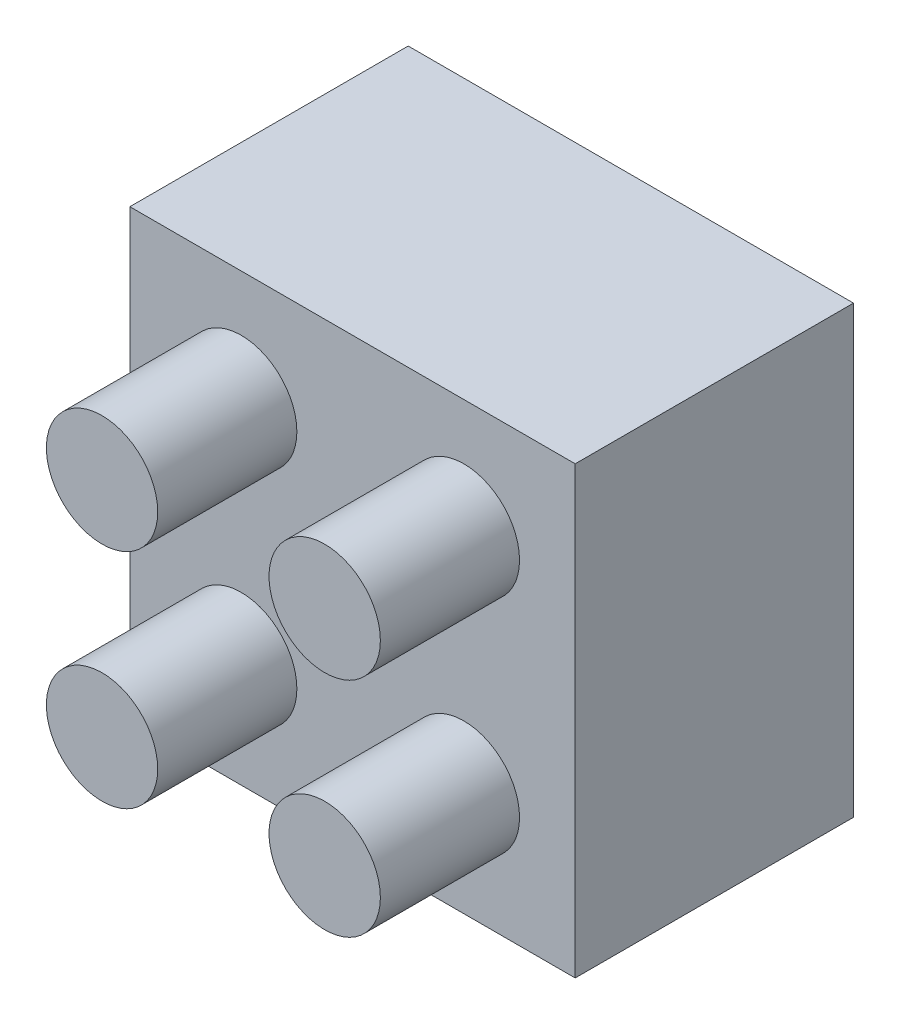
ISO-10303-21;
HEADER;
FILE_DESCRIPTION(('STEP AP214'),'2;1');
FILE_NAME('part.step','',(''),(''),'','','');
FILE_SCHEMA(('AUTOMOTIVE_DESIGN { 1 0 10303 214 1 1 1 1 }'));
ENDSEC;
DATA;
#1=APPLICATION_CONTEXT('core data for automotive mechanical design processes');
#2=APPLICATION_PROTOCOL_DEFINITION('international standard','automotive_design',2000,#1);
#3=PRODUCT_CONTEXT('',#1,'mechanical');
#4=PRODUCT('Part','Part','',(#3));
#5=PRODUCT_RELATED_PRODUCT_CATEGORY('part','',(#4));
#6=PRODUCT_DEFINITION_FORMATION('','',#4);
#7=PRODUCT_DEFINITION_CONTEXT('part definition',#1,'design');
#8=PRODUCT_DEFINITION('design','',#6,#7);
#9=PRODUCT_DEFINITION_SHAPE('','',#8);
#10=(LENGTH_UNIT() NAMED_UNIT(*) SI_UNIT(.MILLI.,.METRE.));
#11=(NAMED_UNIT(*) PLANE_ANGLE_UNIT() SI_UNIT($,.RADIAN.));
#12=(NAMED_UNIT(*) SI_UNIT($,.STERADIAN.) SOLID_ANGLE_UNIT());
#13=UNCERTAINTY_MEASURE_WITH_UNIT(LENGTH_MEASURE(1.E-05),#10,'distance_accuracy_value','');
#14=(GEOMETRIC_REPRESENTATION_CONTEXT(3) GLOBAL_UNCERTAINTY_ASSIGNED_CONTEXT((#13)) GLOBAL_UNIT_ASSIGNED_CONTEXT((#10,
#11,#12)) REPRESENTATION_CONTEXT('',''));
#15=CARTESIAN_POINT('',(0.,0.,0.));
#16=DIRECTION('',(0.,0.,1.));
#17=DIRECTION('',(1.,0.,0.));
#18=AXIS2_PLACEMENT_3D('',#15,#16,#17);
#19=CARTESIAN_POINT('',(8.,8.,10.));
#20=DIRECTION('',(-1.,0.,0.));
#21=DIRECTION('',(0.,-1.,0.));
#22=AXIS2_PLACEMENT_3D('',#19,#20,#21);
#23=PLANE('',#22);
#24=DIRECTION('',(0.,1.,0.));
#25=VECTOR('',#24,1.);
#26=CARTESIAN_POINT('',(8.,8.,0.));
#27=LINE('',#26,#25);
#28=CARTESIAN_POINT('',(8.00000000000001,-8.,0.));
#29=VERTEX_POINT('',#28);
#30=CARTESIAN_POINT('',(8.,8.,0.));
#31=VERTEX_POINT('',#30);
#32=EDGE_CURVE('E170',#29,#31,#27,.T.);
#33=ORIENTED_EDGE('',*,*,#32,.T.);
#34=DIRECTION('',(0.,0.,-1.));
#35=VECTOR('',#34,1.);
#36=CARTESIAN_POINT('',(8.,8.,10.));
#37=LINE('',#36,#35);
#38=CARTESIAN_POINT('',(8.,8.,10.));
#39=VERTEX_POINT('',#38);
#40=EDGE_CURVE('E40',#39,#31,#37,.T.);
#41=ORIENTED_EDGE('',*,*,#40,.F.);
#42=DIRECTION('',(0.,1.,0.));
#43=VECTOR('',#42,1.);
#44=CARTESIAN_POINT('',(8.,8.,10.));
#45=LINE('',#44,#43);
#46=CARTESIAN_POINT('',(8.00000000000001,-8.,10.));
#47=VERTEX_POINT('',#46);
#48=EDGE_CURVE('E173',#47,#39,#45,.T.);
#49=ORIENTED_EDGE('',*,*,#48,.F.);
#50=DIRECTION('',(0.,0.,-1.));
#51=VECTOR('',#50,1.);
#52=CARTESIAN_POINT('',(8.00000000000001,-8.,10.));
#53=LINE('',#52,#51);
#54=EDGE_CURVE('E179',#47,#29,#53,.T.);
#55=ORIENTED_EDGE('',*,*,#54,.T.);
#56=EDGE_LOOP('',(#33,#41,#49,#55));
#57=FACE_BOUND('',#56,.T.);
#58=ADVANCED_FACE('F33',(#57),#23,.F.);
#59=CARTESIAN_POINT('',(-8.,8.,10.));
#60=DIRECTION('',(0.,-1.,0.));
#61=DIRECTION('',(0.,0.,-1.));
#62=AXIS2_PLACEMENT_3D('',#59,#60,#61);
#63=PLANE('',#62);
#64=DIRECTION('',(-1.,0.,0.));
#65=VECTOR('',#64,1.);
#66=CARTESIAN_POINT('',(-8.,8.,0.));
#67=LINE('',#66,#65);
#68=CARTESIAN_POINT('',(-8.,8.,0.));
#69=VERTEX_POINT('',#68);
#70=EDGE_CURVE('E182',#31,#69,#67,.T.);
#71=ORIENTED_EDGE('',*,*,#70,.T.);
#72=DIRECTION('',(0.,0.,-1.));
#73=VECTOR('',#72,1.);
#74=CARTESIAN_POINT('',(-8.,8.,10.));
#75=LINE('',#74,#73);
#76=CARTESIAN_POINT('',(-8.,8.,10.));
#77=VERTEX_POINT('',#76);
#78=EDGE_CURVE('E190',#77,#69,#75,.T.);
#79=ORIENTED_EDGE('',*,*,#78,.F.);
#80=DIRECTION('',(-1.,0.,0.));
#81=VECTOR('',#80,1.);
#82=CARTESIAN_POINT('',(-8.,8.,10.));
#83=LINE('',#82,#81);
#84=EDGE_CURVE('E85',#39,#77,#83,.T.);
#85=ORIENTED_EDGE('',*,*,#84,.F.);
#86=ORIENTED_EDGE('',*,*,#40,.T.);
#87=EDGE_LOOP('',(#71,#79,#85,#86));
#88=FACE_BOUND('',#87,.T.);
#89=ADVANCED_FACE('F193',(#88),#63,.F.);
#90=CARTESIAN_POINT('',(-8.,8.,10.));
#91=DIRECTION('',(1.,0.,0.));
#92=DIRECTION('',(0.,1.,0.));
#93=AXIS2_PLACEMENT_3D('',#90,#91,#92);
#94=PLANE('',#93);
#95=DIRECTION('',(0.,-1.,0.));
#96=VECTOR('',#95,1.);
#97=CARTESIAN_POINT('',(-8.,8.,0.));
#98=LINE('',#97,#96);
#99=CARTESIAN_POINT('',(-7.99999999999999,-8.,0.));
#100=VERTEX_POINT('',#99);
#101=EDGE_CURVE('E184',#69,#100,#98,.T.);
#102=ORIENTED_EDGE('',*,*,#101,.T.);
#103=DIRECTION('',(0.,0.,-1.));
#104=VECTOR('',#103,1.);
#105=CARTESIAN_POINT('',(-7.99999999999999,-8.,10.));
#106=LINE('',#105,#104);
#107=CARTESIAN_POINT('',(-7.99999999999999,-8.,10.));
#108=VERTEX_POINT('',#107);
#109=EDGE_CURVE('E188',#108,#100,#106,.T.);
#110=ORIENTED_EDGE('',*,*,#109,.F.);
#111=DIRECTION('',(0.,-1.,0.));
#112=VECTOR('',#111,1.);
#113=CARTESIAN_POINT('',(-8.,8.,10.));
#114=LINE('',#113,#112);
#115=EDGE_CURVE('E176',#77,#108,#114,.T.);
#116=ORIENTED_EDGE('',*,*,#115,.F.);
#117=ORIENTED_EDGE('',*,*,#78,.T.);
#118=EDGE_LOOP('',(#102,#110,#116,#117));
#119=FACE_BOUND('',#118,.T.);
#120=ADVANCED_FACE('F202',(#119),#94,.F.);
#121=CARTESIAN_POINT('',(-7.99999999999999,-8.,10.));
#122=DIRECTION('',(0.,1.,0.));
#123=DIRECTION('',(0.,0.,1.));
#124=AXIS2_PLACEMENT_3D('',#121,#122,#123);
#125=PLANE('',#124);
#126=DIRECTION('',(1.,0.,0.));
#127=VECTOR('',#126,1.);
#128=CARTESIAN_POINT('',(-7.99999999999999,-8.,0.));
#129=LINE('',#128,#127);
#130=EDGE_CURVE('E77',#100,#29,#129,.T.);
#131=ORIENTED_EDGE('',*,*,#130,.T.);
#132=ORIENTED_EDGE('',*,*,#54,.F.);
#133=DIRECTION('',(1.,0.,0.));
#134=VECTOR('',#133,1.);
#135=CARTESIAN_POINT('',(-7.99999999999999,-8.,10.));
#136=LINE('',#135,#134);
#137=EDGE_CURVE('E56',#108,#47,#136,.T.);
#138=ORIENTED_EDGE('',*,*,#137,.F.);
#139=ORIENTED_EDGE('',*,*,#109,.T.);
#140=EDGE_LOOP('',(#131,#132,#138,#139));
#141=FACE_BOUND('',#140,.T.);
#142=ADVANCED_FACE('F204',(#141),#125,.F.);
#143=CARTESIAN_POINT('',(0.,0.,10.));
#144=DIRECTION('',(0.,0.,1.));
#145=DIRECTION('',(1.,0.,0.));
#146=AXIS2_PLACEMENT_3D('',#143,#144,#145);
#147=PLANE('',#146);
#148=CARTESIAN_POINT('',(-3.99999999999992,-4.,10.));
#149=DIRECTION('',(0.,0.,1.));
#150=DIRECTION('',(1.,0.,0.));
#151=AXIS2_PLACEMENT_3D('',#148,#149,#150);
#152=CIRCLE('',#151,2.);
#153=CARTESIAN_POINT('',(-1.99999999999992,-4.,10.));
#154=VERTEX_POINT('',#153);
#155=EDGE_CURVE('E145',#154,#154,#152,.T.);
#156=ORIENTED_EDGE('',*,*,#155,.F.);
#157=EDGE_LOOP('',(#156));
#158=FACE_BOUND('',#157,.T.);
#159=CARTESIAN_POINT('',(4.00000000000008,-4.,10.));
#160=DIRECTION('',(0.,0.,1.));
#161=DIRECTION('',(1.,0.,0.));
#162=AXIS2_PLACEMENT_3D('',#159,#160,#161);
#163=CIRCLE('',#162,2.);
#164=CARTESIAN_POINT('',(6.00000000000008,-4.,10.));
#165=VERTEX_POINT('',#164);
#166=EDGE_CURVE('E152',#165,#165,#163,.T.);
#167=ORIENTED_EDGE('',*,*,#166,.F.);
#168=EDGE_LOOP('',(#167));
#169=FACE_BOUND('',#168,.T.);
#170=CARTESIAN_POINT('',(4.,4.,10.));
#171=DIRECTION('',(0.,0.,1.));
#172=DIRECTION('',(1.,0.,0.));
#173=AXIS2_PLACEMENT_3D('',#170,#171,#172);
#174=CIRCLE('',#173,2.);
#175=CARTESIAN_POINT('',(6.,4.,10.));
#176=VERTEX_POINT('',#175);
#177=EDGE_CURVE('E158',#176,#176,#174,.T.);
#178=ORIENTED_EDGE('',*,*,#177,.F.);
#179=EDGE_LOOP('',(#178));
#180=FACE_BOUND('',#179,.T.);
#181=CARTESIAN_POINT('',(-4.,4.,10.));
#182=DIRECTION('',(0.,0.,1.));
#183=DIRECTION('',(1.,0.,0.));
#184=AXIS2_PLACEMENT_3D('',#181,#182,#183);
#185=CIRCLE('',#184,2.);
#186=CARTESIAN_POINT('',(-2.,4.,10.));
#187=VERTEX_POINT('',#186);
#188=EDGE_CURVE('E164',#187,#187,#185,.T.);
#189=ORIENTED_EDGE('',*,*,#188,.F.);
#190=EDGE_LOOP('',(#189));
#191=FACE_BOUND('',#190,.T.);
#192=ORIENTED_EDGE('',*,*,#48,.T.);
#193=ORIENTED_EDGE('',*,*,#84,.T.);
#194=ORIENTED_EDGE('',*,*,#115,.T.);
#195=ORIENTED_EDGE('',*,*,#137,.T.);
#196=EDGE_LOOP('',(#192,#193,#194,#195));
#197=FACE_BOUND('',#196,.T.);
#198=ADVANCED_FACE('F205',(#158,#169,#180,#191,#197),#147,.T.);
#199=CARTESIAN_POINT('',(0.,0.,0.));
#200=DIRECTION('',(0.,0.,1.));
#201=DIRECTION('',(1.,0.,0.));
#202=AXIS2_PLACEMENT_3D('',#199,#200,#201);
#203=PLANE('',#202);
#204=DIRECTION('',(1.,0.,0.));
#205=VECTOR('',#204,1.);
#206=CARTESIAN_POINT('',(6.75,6.82507599071869,0.));
#207=LINE('',#206,#205);
#208=CARTESIAN_POINT('',(-6.75,6.82507599071869,0.));
#209=VERTEX_POINT('',#208);
#210=CARTESIAN_POINT('',(6.75,6.82507599071869,0.));
#211=VERTEX_POINT('',#210);
#212=EDGE_CURVE('E139',#209,#211,#207,.T.);
#213=ORIENTED_EDGE('',*,*,#212,.F.);
#214=DIRECTION('',(0.,1.,0.));
#215=VECTOR('',#214,1.);
#216=CARTESIAN_POINT('',(-6.75,-6.82507599071869,0.));
#217=LINE('',#216,#215);
#218=CARTESIAN_POINT('',(-6.75,-6.82507599071869,0.));
#219=VERTEX_POINT('',#218);
#220=EDGE_CURVE('E47',#219,#209,#217,.T.);
#221=ORIENTED_EDGE('',*,*,#220,.F.);
#222=DIRECTION('',(-1.,0.,0.));
#223=VECTOR('',#222,1.);
#224=CARTESIAN_POINT('',(6.75,-6.82507599071869,0.));
#225=LINE('',#224,#223);
#226=CARTESIAN_POINT('',(6.75,-6.82507599071869,0.));
#227=VERTEX_POINT('',#226);
#228=EDGE_CURVE('E127',#227,#219,#225,.T.);
#229=ORIENTED_EDGE('',*,*,#228,.F.);
#230=DIRECTION('',(0.,-1.,0.));
#231=VECTOR('',#230,1.);
#232=CARTESIAN_POINT('',(6.75,-6.82507599071869,0.));
#233=LINE('',#232,#231);
#234=EDGE_CURVE('E130',#211,#227,#233,.T.);
#235=ORIENTED_EDGE('',*,*,#234,.F.);
#236=EDGE_LOOP('',(#213,#221,#229,#235));
#237=FACE_BOUND('',#236,.T.);
#238=ORIENTED_EDGE('',*,*,#32,.F.);
#239=ORIENTED_EDGE('',*,*,#130,.F.);
#240=ORIENTED_EDGE('',*,*,#101,.F.);
#241=ORIENTED_EDGE('',*,*,#70,.F.);
#242=EDGE_LOOP('',(#238,#239,#240,#241));
#243=FACE_BOUND('',#242,.T.);
#244=ADVANCED_FACE('F198',(#237,#243),#203,.F.);
#245=CARTESIAN_POINT('',(-4.,4.,15.));
#246=DIRECTION('',(0.,0.,-1.));
#247=DIRECTION('',(-1.,0.,0.));
#248=AXIS2_PLACEMENT_3D('',#245,#246,#247);
#249=CYLINDRICAL_SURFACE('',#248,2.);
#250=CARTESIAN_POINT('',(-4.,4.,15.));
#251=DIRECTION('',(0.,0.,1.));
#252=DIRECTION('',(1.,0.,0.));
#253=AXIS2_PLACEMENT_3D('',#250,#251,#252);
#254=CIRCLE('',#253,2.);
#255=CARTESIAN_POINT('',(-2.,4.,15.));
#256=VERTEX_POINT('',#255);
#257=EDGE_CURVE('E167',#256,#256,#254,.T.);
#258=ORIENTED_EDGE('',*,*,#257,.F.);
#259=EDGE_LOOP('',(#258));
#260=FACE_BOUND('',#259,.T.);
#261=ORIENTED_EDGE('',*,*,#188,.T.);
#262=EDGE_LOOP('',(#261));
#263=FACE_BOUND('',#262,.T.);
#264=ADVANCED_FACE('F213',(#260,#263),#249,.T.);
#265=CARTESIAN_POINT('',(-4.,4.,15.));
#266=DIRECTION('',(0.,0.,1.));
#267=DIRECTION('',(1.,0.,0.));
#268=AXIS2_PLACEMENT_3D('',#265,#266,#267);
#269=PLANE('',#268);
#270=ORIENTED_EDGE('',*,*,#257,.T.);
#271=EDGE_LOOP('',(#270));
#272=FACE_BOUND('',#271,.T.);
#273=ADVANCED_FACE('F248',(#272),#269,.T.);
#274=CARTESIAN_POINT('',(4.,4.,15.));
#275=DIRECTION('',(0.,0.,-1.));
#276=DIRECTION('',(-1.,0.,0.));
#277=AXIS2_PLACEMENT_3D('',#274,#275,#276);
#278=CYLINDRICAL_SURFACE('',#277,2.);
#279=CARTESIAN_POINT('',(4.,4.,15.));
#280=DIRECTION('',(0.,0.,1.));
#281=DIRECTION('',(1.,0.,0.));
#282=AXIS2_PLACEMENT_3D('',#279,#280,#281);
#283=CIRCLE('',#282,2.);
#284=CARTESIAN_POINT('',(6.,4.,15.));
#285=VERTEX_POINT('',#284);
#286=EDGE_CURVE('E161',#285,#285,#283,.T.);
#287=ORIENTED_EDGE('',*,*,#286,.F.);
#288=EDGE_LOOP('',(#287));
#289=FACE_BOUND('',#288,.T.);
#290=ORIENTED_EDGE('',*,*,#177,.T.);
#291=EDGE_LOOP('',(#290));
#292=FACE_BOUND('',#291,.T.);
#293=ADVANCED_FACE('F257',(#289,#292),#278,.T.);
#294=CARTESIAN_POINT('',(4.,4.,15.));
#295=DIRECTION('',(0.,0.,1.));
#296=DIRECTION('',(1.,0.,0.));
#297=AXIS2_PLACEMENT_3D('',#294,#295,#296);
#298=PLANE('',#297);
#299=ORIENTED_EDGE('',*,*,#286,.T.);
#300=EDGE_LOOP('',(#299));
#301=FACE_BOUND('',#300,.T.);
#302=ADVANCED_FACE('F267',(#301),#298,.T.);
#303=CARTESIAN_POINT('',(4.00000000000008,-4.,15.));
#304=DIRECTION('',(0.,0.,-1.));
#305=DIRECTION('',(-1.,0.,0.));
#306=AXIS2_PLACEMENT_3D('',#303,#304,#305);
#307=CYLINDRICAL_SURFACE('',#306,2.);
#308=CARTESIAN_POINT('',(4.00000000000008,-4.,15.));
#309=DIRECTION('',(0.,0.,1.));
#310=DIRECTION('',(1.,0.,0.));
#311=AXIS2_PLACEMENT_3D('',#308,#309,#310);
#312=CIRCLE('',#311,2.);
#313=CARTESIAN_POINT('',(6.00000000000008,-4.,15.));
#314=VERTEX_POINT('',#313);
#315=EDGE_CURVE('E155',#314,#314,#312,.T.);
#316=ORIENTED_EDGE('',*,*,#315,.F.);
#317=EDGE_LOOP('',(#316));
#318=FACE_BOUND('',#317,.T.);
#319=ORIENTED_EDGE('',*,*,#166,.T.);
#320=EDGE_LOOP('',(#319));
#321=FACE_BOUND('',#320,.T.);
#322=ADVANCED_FACE('F277',(#318,#321),#307,.T.);
#323=CARTESIAN_POINT('',(4.00000000000008,-4.,15.));
#324=DIRECTION('',(0.,0.,1.));
#325=DIRECTION('',(1.,0.,0.));
#326=AXIS2_PLACEMENT_3D('',#323,#324,#325);
#327=PLANE('',#326);
#328=ORIENTED_EDGE('',*,*,#315,.T.);
#329=EDGE_LOOP('',(#328));
#330=FACE_BOUND('',#329,.T.);
#331=ADVANCED_FACE('F287',(#330),#327,.T.);
#332=CARTESIAN_POINT('',(-3.99999999999992,-4.,15.));
#333=DIRECTION('',(0.,0.,-1.));
#334=DIRECTION('',(-1.,0.,0.));
#335=AXIS2_PLACEMENT_3D('',#332,#333,#334);
#336=CYLINDRICAL_SURFACE('',#335,2.);
#337=CARTESIAN_POINT('',(-3.99999999999992,-4.,15.));
#338=DIRECTION('',(0.,0.,1.));
#339=DIRECTION('',(1.,0.,0.));
#340=AXIS2_PLACEMENT_3D('',#337,#338,#339);
#341=CIRCLE('',#340,2.);
#342=CARTESIAN_POINT('',(-1.99999999999992,-4.,15.));
#343=VERTEX_POINT('',#342);
#344=EDGE_CURVE('E149',#343,#343,#341,.T.);
#345=ORIENTED_EDGE('',*,*,#344,.F.);
#346=EDGE_LOOP('',(#345));
#347=FACE_BOUND('',#346,.T.);
#348=ORIENTED_EDGE('',*,*,#155,.T.);
#349=EDGE_LOOP('',(#348));
#350=FACE_BOUND('',#349,.T.);
#351=ADVANCED_FACE('F297',(#347,#350),#336,.T.);
#352=CARTESIAN_POINT('',(-3.99999999999992,-4.,15.));
#353=DIRECTION('',(0.,0.,1.));
#354=DIRECTION('',(1.,0.,0.));
#355=AXIS2_PLACEMENT_3D('',#352,#353,#354);
#356=PLANE('',#355);
#357=ORIENTED_EDGE('',*,*,#344,.T.);
#358=EDGE_LOOP('',(#357));
#359=FACE_BOUND('',#358,.T.);
#360=ADVANCED_FACE('F307',(#359),#356,.T.);
#361=CARTESIAN_POINT('',(-6.75,-6.82507599071869,9.));
#362=DIRECTION('',(-1.,0.,0.));
#363=DIRECTION('',(0.,0.,1.));
#364=AXIS2_PLACEMENT_3D('',#361,#362,#363);
#365=PLANE('',#364);
#366=ORIENTED_EDGE('',*,*,#220,.T.);
#367=DIRECTION('',(0.,0.,-1.));
#368=VECTOR('',#367,1.);
#369=CARTESIAN_POINT('',(-6.75,6.82507599071869,9.));
#370=LINE('',#369,#368);
#371=CARTESIAN_POINT('',(-6.75,6.82507599071869,9.));
#372=VERTEX_POINT('',#371);
#373=EDGE_CURVE('E105',#372,#209,#370,.T.);
#374=ORIENTED_EDGE('',*,*,#373,.F.);
#375=DIRECTION('',(0.,1.,0.));
#376=VECTOR('',#375,1.);
#377=CARTESIAN_POINT('',(-6.75,-6.82507599071869,9.));
#378=LINE('',#377,#376);
#379=CARTESIAN_POINT('',(-6.75,-6.82507599071869,9.));
#380=VERTEX_POINT('',#379);
#381=EDGE_CURVE('E109',#380,#372,#378,.T.);
#382=ORIENTED_EDGE('',*,*,#381,.F.);
#383=DIRECTION('',(0.,0.,-1.));
#384=VECTOR('',#383,1.);
#385=CARTESIAN_POINT('',(-6.75,-6.82507599071869,9.));
#386=LINE('',#385,#384);
#387=EDGE_CURVE('E143',#380,#219,#386,.T.);
#388=ORIENTED_EDGE('',*,*,#387,.T.);
#389=EDGE_LOOP('',(#366,#374,#382,#388));
#390=FACE_BOUND('',#389,.T.);
#391=ADVANCED_FACE('F107',(#390),#365,.F.);
#392=CARTESIAN_POINT('',(6.75,-6.82507599071869,9.));
#393=DIRECTION('',(0.,-1.,0.));
#394=DIRECTION('',(0.,0.,-1.));
#395=AXIS2_PLACEMENT_3D('',#392,#393,#394);
#396=PLANE('',#395);
#397=ORIENTED_EDGE('',*,*,#228,.T.);
#398=ORIENTED_EDGE('',*,*,#387,.F.);
#399=DIRECTION('',(-1.,0.,0.));
#400=VECTOR('',#399,1.);
#401=CARTESIAN_POINT('',(6.75,-6.82507599071869,9.));
#402=LINE('',#401,#400);
#403=CARTESIAN_POINT('',(6.75,-6.82507599071869,9.));
#404=VERTEX_POINT('',#403);
#405=EDGE_CURVE('E115',#404,#380,#402,.T.);
#406=ORIENTED_EDGE('',*,*,#405,.F.);
#407=DIRECTION('',(0.,0.,-1.));
#408=VECTOR('',#407,1.);
#409=CARTESIAN_POINT('',(6.75,-6.82507599071869,9.));
#410=LINE('',#409,#408);
#411=EDGE_CURVE('E146',#404,#227,#410,.T.);
#412=ORIENTED_EDGE('',*,*,#411,.T.);
#413=EDGE_LOOP('',(#397,#398,#406,#412));
#414=FACE_BOUND('',#413,.T.);
#415=ADVANCED_FACE('F331',(#414),#396,.F.);
#416=CARTESIAN_POINT('',(6.75,-6.82507599071869,9.));
#417=DIRECTION('',(1.,0.,0.));
#418=DIRECTION('',(0.,0.,-1.));
#419=AXIS2_PLACEMENT_3D('',#416,#417,#418);
#420=PLANE('',#419);
#421=ORIENTED_EDGE('',*,*,#234,.T.);
#422=ORIENTED_EDGE('',*,*,#411,.F.);
#423=DIRECTION('',(0.,-1.,0.));
#424=VECTOR('',#423,1.);
#425=CARTESIAN_POINT('',(6.75,-6.82507599071869,9.));
#426=LINE('',#425,#424);
#427=CARTESIAN_POINT('',(6.75,6.82507599071869,9.));
#428=VERTEX_POINT('',#427);
#429=EDGE_CURVE('E123',#428,#404,#426,.T.);
#430=ORIENTED_EDGE('',*,*,#429,.F.);
#431=DIRECTION('',(0.,0.,-1.));
#432=VECTOR('',#431,1.);
#433=CARTESIAN_POINT('',(6.75,6.82507599071869,9.));
#434=LINE('',#433,#432);
#435=EDGE_CURVE('E114',#428,#211,#434,.T.);
#436=ORIENTED_EDGE('',*,*,#435,.T.);
#437=EDGE_LOOP('',(#421,#422,#430,#436));
#438=FACE_BOUND('',#437,.T.);
#439=ADVANCED_FACE('F340',(#438),#420,.F.);
#440=CARTESIAN_POINT('',(6.75,6.82507599071869,9.));
#441=DIRECTION('',(0.,1.,0.));
#442=DIRECTION('',(0.,0.,1.));
#443=AXIS2_PLACEMENT_3D('',#440,#441,#442);
#444=PLANE('',#443);
#445=ORIENTED_EDGE('',*,*,#212,.T.);
#446=ORIENTED_EDGE('',*,*,#435,.F.);
#447=DIRECTION('',(1.,0.,0.));
#448=VECTOR('',#447,1.);
#449=CARTESIAN_POINT('',(6.75,6.82507599071869,9.));
#450=LINE('',#449,#448);
#451=EDGE_CURVE('E118',#372,#428,#450,.T.);
#452=ORIENTED_EDGE('',*,*,#451,.F.);
#453=ORIENTED_EDGE('',*,*,#373,.T.);
#454=EDGE_LOOP('',(#445,#446,#452,#453));
#455=FACE_BOUND('',#454,.T.);
#456=ADVANCED_FACE('F119',(#455),#444,.F.);
#457=CARTESIAN_POINT('',(0.,0.,9.));
#458=DIRECTION('',(0.,0.,1.));
#459=DIRECTION('',(1.,0.,0.));
#460=AXIS2_PLACEMENT_3D('',#457,#458,#459);
#461=PLANE('',#460);
#462=CARTESIAN_POINT('',(0.,0.,9.));
#463=DIRECTION('',(0.,0.,1.));
#464=DIRECTION('',(1.,0.,0.));
#465=AXIS2_PLACEMENT_3D('',#462,#463,#464);
#466=CIRCLE('',#465,3.7);
#467=CARTESIAN_POINT('',(3.7,0.,9.));
#468=VERTEX_POINT('',#467);
#469=EDGE_CURVE('E11',#468,#468,#466,.F.);
#470=ORIENTED_EDGE('',*,*,#469,.F.);
#471=EDGE_LOOP('',(#470));
#472=FACE_BOUND('',#471,.T.);
#473=ORIENTED_EDGE('',*,*,#381,.T.);
#474=ORIENTED_EDGE('',*,*,#451,.T.);
#475=ORIENTED_EDGE('',*,*,#429,.T.);
#476=ORIENTED_EDGE('',*,*,#405,.T.);
#477=EDGE_LOOP('',(#473,#474,#475,#476));
#478=FACE_BOUND('',#477,.T.);
#479=ADVANCED_FACE('F125',(#472,#478),#461,.F.);
#480=CARTESIAN_POINT('',(0.,0.,0.));
#481=DIRECTION('',(0.,0.,-1.));
#482=DIRECTION('',(-1.,0.,0.));
#483=AXIS2_PLACEMENT_3D('',#480,#481,#482);
#484=PLANE('',#483);
#485=CARTESIAN_POINT('',(0.,0.,0.));
#486=DIRECTION('',(0.,0.,-1.));
#487=DIRECTION('',(-1.,0.,0.));
#488=AXIS2_PLACEMENT_3D('',#485,#486,#487);
#489=CIRCLE('',#488,3.7);
#490=CARTESIAN_POINT('',(-3.7,0.,0.));
#491=VERTEX_POINT('',#490);
#492=EDGE_CURVE('E133',#491,#491,#489,.T.);
#493=ORIENTED_EDGE('',*,*,#492,.T.);
#494=EDGE_LOOP('',(#493));
#495=FACE_BOUND('',#494,.T.);
#496=CARTESIAN_POINT('',(0.,0.,0.));
#497=DIRECTION('',(0.,0.,-1.));
#498=DIRECTION('',(-1.,0.,0.));
#499=AXIS2_PLACEMENT_3D('',#496,#497,#498);
#500=CIRCLE('',#499,2.7);
#501=CARTESIAN_POINT('',(-2.7,0.,0.));
#502=VERTEX_POINT('',#501);
#503=EDGE_CURVE('E414',#502,#502,#500,.T.);
#504=ORIENTED_EDGE('',*,*,#503,.F.);
#505=EDGE_LOOP('',(#504));
#506=FACE_BOUND('',#505,.T.);
#507=ADVANCED_FACE('F367',(#495,#506),#484,.T.);
#508=CARTESIAN_POINT('',(0.,0.,0.));
#509=DIRECTION('',(0.,0.,1.));
#510=DIRECTION('',(1.,0.,0.));
#511=AXIS2_PLACEMENT_3D('',#508,#509,#510);
#512=CYLINDRICAL_SURFACE('',#511,3.7);
#513=ORIENTED_EDGE('',*,*,#492,.F.);
#514=EDGE_LOOP('',(#513));
#515=FACE_BOUND('',#514,.T.);
#516=ORIENTED_EDGE('',*,*,#469,.T.);
#517=EDGE_LOOP('',(#516));
#518=FACE_BOUND('',#517,.T.);
#519=ADVANCED_FACE('F379',(#515,#518),#512,.T.);
#520=CARTESIAN_POINT('',(0.,0.,0.));
#521=DIRECTION('',(0.,0.,1.));
#522=DIRECTION('',(1.,0.,0.));
#523=AXIS2_PLACEMENT_3D('',#520,#521,#522);
#524=CYLINDRICAL_SURFACE('',#523,2.7);
#525=ORIENTED_EDGE('',*,*,#503,.T.);
#526=EDGE_LOOP('',(#525));
#527=FACE_BOUND('',#526,.T.);
#528=CARTESIAN_POINT('',(0.,0.,9.));
#529=DIRECTION('',(0.,0.,-1.));
#530=DIRECTION('',(-1.,0.,0.));
#531=AXIS2_PLACEMENT_3D('',#528,#529,#530);
#532=CIRCLE('',#531,2.7);
#533=CARTESIAN_POINT('',(-2.7,0.,9.));
#534=VERTEX_POINT('',#533);
#535=EDGE_CURVE('E412',#534,#534,#532,.T.);
#536=ORIENTED_EDGE('',*,*,#535,.F.);
#537=EDGE_LOOP('',(#536));
#538=FACE_BOUND('',#537,.T.);
#539=ADVANCED_FACE('F389',(#527,#538),#524,.F.);
#540=ORIENTED_EDGE('',*,*,#535,.T.);
#541=EDGE_LOOP('',(#540));
#542=FACE_BOUND('',#541,.T.);
#543=ADVANCED_FACE('F370',(#542),#461,.F.);
#544=CLOSED_SHELL('',(#58,#89,#120,#142,#198,#244,#264,#273,#293,#302,#322,#331,#351,#360,#391,
#415,#439,#456,#479,#507,#519,#539,#543));
#545=MANIFOLD_SOLID_BREP('B2',#544);
#546=ADVANCED_BREP_SHAPE_REPRESENTATION('',(#18,#545),#14);
#547=SHAPE_DEFINITION_REPRESENTATION(#9,#546);
ENDSEC;
END-ISO-10303-21;
